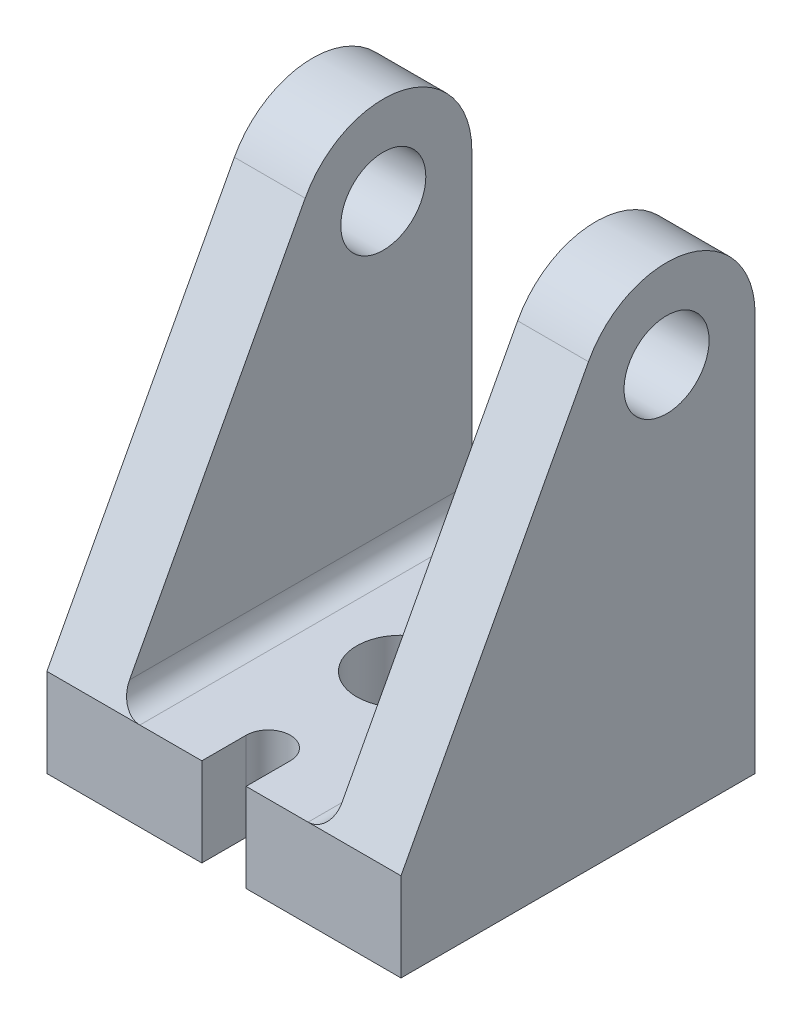
ISO-10303-21;
HEADER;
FILE_DESCRIPTION(('STEP AP214'),'2;1');
FILE_NAME('part.step','',(''),(''),'','','');
FILE_SCHEMA(('AUTOMOTIVE_DESIGN { 1 0 10303 214 1 1 1 1 }'));
ENDSEC;
DATA;
#1=APPLICATION_CONTEXT('core data for automotive mechanical design processes');
#2=APPLICATION_PROTOCOL_DEFINITION('international standard','automotive_design',2000,#1);
#3=PRODUCT_CONTEXT('',#1,'mechanical');
#4=PRODUCT('Part','Part','',(#3));
#5=PRODUCT_RELATED_PRODUCT_CATEGORY('part','',(#4));
#6=PRODUCT_DEFINITION_FORMATION('','',#4);
#7=PRODUCT_DEFINITION_CONTEXT('part definition',#1,'design');
#8=PRODUCT_DEFINITION('design','',#6,#7);
#9=PRODUCT_DEFINITION_SHAPE('','',#8);
#10=(LENGTH_UNIT() NAMED_UNIT(*) SI_UNIT(.MILLI.,.METRE.));
#11=(NAMED_UNIT(*) PLANE_ANGLE_UNIT() SI_UNIT($,.RADIAN.));
#12=(NAMED_UNIT(*) SI_UNIT($,.STERADIAN.) SOLID_ANGLE_UNIT());
#13=UNCERTAINTY_MEASURE_WITH_UNIT(LENGTH_MEASURE(1.E-05),#10,'distance_accuracy_value','');
#14=(GEOMETRIC_REPRESENTATION_CONTEXT(3) GLOBAL_UNCERTAINTY_ASSIGNED_CONTEXT((#13)) GLOBAL_UNIT_ASSIGNED_CONTEXT((#10,
#11,#12)) REPRESENTATION_CONTEXT('',''));
#15=CARTESIAN_POINT('',(0.,0.,0.));
#16=DIRECTION('',(0.,0.,1.));
#17=DIRECTION('',(1.,0.,0.));
#18=AXIS2_PLACEMENT_3D('',#15,#16,#17);
#19=CARTESIAN_POINT('',(-25.4,12.7,25.4));
#20=DIRECTION('',(0.,0.,-1.));
#21=DIRECTION('',(-1.,0.,0.));
#22=AXIS2_PLACEMENT_3D('',#19,#20,#21);
#23=PLANE('',#22);
#24=DIRECTION('',(1.,0.,0.));
#25=VECTOR('',#24,1.);
#26=CARTESIAN_POINT('',(-25.4,0.,25.4));
#27=LINE('',#26,#25);
#28=CARTESIAN_POINT('',(-25.4,0.,25.4));
#29=VERTEX_POINT('',#28);
#30=CARTESIAN_POINT('',(-3.175,0.,25.4));
#31=VERTEX_POINT('',#30);
#32=EDGE_CURVE('E168',#29,#31,#27,.T.);
#33=ORIENTED_EDGE('',*,*,#32,.T.);
#34=DIRECTION('',(0.,1.,0.));
#35=VECTOR('',#34,1.);
#36=CARTESIAN_POINT('',(-3.175,0.,25.4));
#37=LINE('',#36,#35);
#38=CARTESIAN_POINT('',(-3.175,12.7,25.4));
#39=VERTEX_POINT('',#38);
#40=EDGE_CURVE('E470',#31,#39,#37,.T.);
#41=ORIENTED_EDGE('',*,*,#40,.T.);
#42=DIRECTION('',(1.,0.,0.));
#43=VECTOR('',#42,1.);
#44=CARTESIAN_POINT('',(-25.4,12.7,25.4));
#45=LINE('',#44,#43);
#46=CARTESIAN_POINT('',(-12.065,12.7,25.4));
#47=VERTEX_POINT('',#46);
#48=EDGE_CURVE('E279',#47,#39,#45,.T.);
#49=ORIENTED_EDGE('',*,*,#48,.F.);
#50=CARTESIAN_POINT('',(-25.4,12.7,25.4));
#51=VERTEX_POINT('',#50);
#52=EDGE_CURVE('E216',#51,#47,#45,.T.);
#53=ORIENTED_EDGE('',*,*,#52,.F.);
#54=DIRECTION('',(0.,-1.,0.));
#55=VECTOR('',#54,1.);
#56=CARTESIAN_POINT('',(-25.4,12.7,25.4));
#57=LINE('',#56,#55);
#58=EDGE_CURVE('E187',#51,#29,#57,.T.);
#59=ORIENTED_EDGE('',*,*,#58,.T.);
#60=EDGE_LOOP('',(#33,#41,#49,#53,#59));
#61=FACE_BOUND('',#60,.T.);
#62=ADVANCED_FACE('F41',(#61),#23,.F.);
#63=CARTESIAN_POINT('',(-25.4,12.7,-25.4));
#64=DIRECTION('',(1.,0.,0.));
#65=DIRECTION('',(0.,0.,-1.));
#66=AXIS2_PLACEMENT_3D('',#63,#64,#65);
#67=PLANE('',#66);
#68=DIRECTION('',(0.,0.,1.));
#69=VECTOR('',#68,1.);
#70=CARTESIAN_POINT('',(-25.4,0.,-25.4));
#71=LINE('',#70,#69);
#72=CARTESIAN_POINT('',(-25.4,0.,-25.4));
#73=VERTEX_POINT('',#72);
#74=EDGE_CURVE('E170',#73,#29,#71,.T.);
#75=ORIENTED_EDGE('',*,*,#74,.T.);
#76=ORIENTED_EDGE('',*,*,#58,.F.);
#77=DIRECTION('',(0.,-0.882352941176471,0.470588235294118));
#78=VECTOR('',#77,1.);
#79=CARTESIAN_POINT('',(-25.4,12.7,25.4));
#80=LINE('',#79,#78);
#81=CARTESIAN_POINT('',(-25.4,63.1264705882353,-1.49411764705882));
#82=VERTEX_POINT('',#81);
#83=EDGE_CURVE('E238',#82,#51,#80,.T.);
#84=ORIENTED_EDGE('',*,*,#83,.F.);
#85=CARTESIAN_POINT('',(-25.4,57.15,-12.7));
#86=DIRECTION('',(1.,0.,0.));
#87=DIRECTION('',(0.,0.,1.));
#88=AXIS2_PLACEMENT_3D('',#85,#86,#87);
#89=CIRCLE('',#88,12.7);
#90=CARTESIAN_POINT('',(-25.4,57.15,-25.4));
#91=VERTEX_POINT('',#90);
#92=EDGE_CURVE('E232',#91,#82,#89,.T.);
#93=ORIENTED_EDGE('',*,*,#92,.F.);
#94=DIRECTION('',(0.,-1.,0.));
#95=VECTOR('',#94,1.);
#96=CARTESIAN_POINT('',(-25.4,12.7,-25.4));
#97=LINE('',#96,#95);
#98=EDGE_CURVE('E180',#91,#73,#97,.T.);
#99=ORIENTED_EDGE('',*,*,#98,.T.);
#100=EDGE_LOOP('',(#75,#76,#84,#93,#99));
#101=FACE_BOUND('',#100,.T.);
#102=CARTESIAN_POINT('',(-25.4,57.15,-12.7));
#103=DIRECTION('',(1.,0.,0.));
#104=DIRECTION('',(0.,0.,-1.));
#105=AXIS2_PLACEMENT_3D('',#102,#103,#104);
#106=CIRCLE('',#105,6.1);
#107=CARTESIAN_POINT('',(-25.4,57.15,-18.8));
#108=VERTEX_POINT('',#107);
#109=EDGE_CURVE('E241',#108,#108,#106,.T.);
#110=ORIENTED_EDGE('',*,*,#109,.T.);
#111=EDGE_LOOP('',(#110));
#112=FACE_BOUND('',#111,.T.);
#113=ADVANCED_FACE('F301',(#101,#112),#67,.F.);
#114=CARTESIAN_POINT('',(3.175,12.7,25.4));
#115=VERTEX_POINT('',#114);
#116=CARTESIAN_POINT('',(12.065,12.7,25.4));
#117=VERTEX_POINT('',#116);
#118=EDGE_CURVE('E158',#115,#117,#45,.T.);
#119=ORIENTED_EDGE('',*,*,#118,.F.);
#120=DIRECTION('',(0.,1.,0.));
#121=VECTOR('',#120,1.);
#122=CARTESIAN_POINT('',(3.175,0.,25.4));
#123=LINE('',#122,#121);
#124=CARTESIAN_POINT('',(3.175,0.,25.4));
#125=VERTEX_POINT('',#124);
#126=EDGE_CURVE('E150',#125,#115,#123,.T.);
#127=ORIENTED_EDGE('',*,*,#126,.F.);
#128=CARTESIAN_POINT('',(25.4,0.,25.4));
#129=VERTEX_POINT('',#128);
#130=EDGE_CURVE('E156',#125,#129,#27,.T.);
#131=ORIENTED_EDGE('',*,*,#130,.T.);
#132=DIRECTION('',(0.,-1.,0.));
#133=VECTOR('',#132,1.);
#134=CARTESIAN_POINT('',(25.4,12.7,25.4));
#135=LINE('',#134,#133);
#136=CARTESIAN_POINT('',(25.4,12.7,25.4));
#137=VERTEX_POINT('',#136);
#138=EDGE_CURVE('E183',#137,#129,#135,.T.);
#139=ORIENTED_EDGE('',*,*,#138,.F.);
#140=DIRECTION('',(1.,0.,0.));
#141=VECTOR('',#140,1.);
#142=CARTESIAN_POINT('',(15.24,12.7,25.4));
#143=LINE('',#142,#141);
#144=EDGE_CURVE('E60',#117,#137,#143,.T.);
#145=ORIENTED_EDGE('',*,*,#144,.F.);
#146=EDGE_LOOP('',(#119,#127,#131,#139,#145));
#147=FACE_BOUND('',#146,.T.);
#148=ADVANCED_FACE('F159',(#147),#23,.F.);
#149=CARTESIAN_POINT('',(25.4,12.7,-25.4));
#150=DIRECTION('',(-1.,0.,0.));
#151=DIRECTION('',(0.,0.,1.));
#152=AXIS2_PLACEMENT_3D('',#149,#150,#151);
#153=PLANE('',#152);
#154=DIRECTION('',(0.,0.,-1.));
#155=VECTOR('',#154,1.);
#156=CARTESIAN_POINT('',(25.4,0.,-25.4));
#157=LINE('',#156,#155);
#158=CARTESIAN_POINT('',(25.4,0.,-25.4));
#159=VERTEX_POINT('',#158);
#160=EDGE_CURVE('E164',#129,#159,#157,.T.);
#161=ORIENTED_EDGE('',*,*,#160,.T.);
#162=DIRECTION('',(0.,-1.,0.));
#163=VECTOR('',#162,1.);
#164=CARTESIAN_POINT('',(25.4,12.7,-25.4));
#165=LINE('',#164,#163);
#166=CARTESIAN_POINT('',(25.4,57.15,-25.4));
#167=VERTEX_POINT('',#166);
#168=EDGE_CURVE('E179',#167,#159,#165,.T.);
#169=ORIENTED_EDGE('',*,*,#168,.F.);
#170=CARTESIAN_POINT('',(25.4,57.15,-12.7));
#171=DIRECTION('',(1.,0.,0.));
#172=DIRECTION('',(0.,0.,1.));
#173=AXIS2_PLACEMENT_3D('',#170,#171,#172);
#174=CIRCLE('',#173,12.7);
#175=CARTESIAN_POINT('',(25.4,63.1264705882353,-1.49411764705882));
#176=VERTEX_POINT('',#175);
#177=EDGE_CURVE('E257',#167,#176,#174,.T.);
#178=ORIENTED_EDGE('',*,*,#177,.T.);
#179=DIRECTION('',(0.,-0.882352941176471,0.470588235294118));
#180=VECTOR('',#179,1.);
#181=CARTESIAN_POINT('',(25.4,12.7,25.4));
#182=LINE('',#181,#180);
#183=EDGE_CURVE('E264',#176,#137,#182,.T.);
#184=ORIENTED_EDGE('',*,*,#183,.T.);
#185=ORIENTED_EDGE('',*,*,#138,.T.);
#186=EDGE_LOOP('',(#161,#169,#178,#184,#185));
#187=FACE_BOUND('',#186,.T.);
#188=CARTESIAN_POINT('',(25.4,57.15,-12.7));
#189=DIRECTION('',(1.,0.,0.));
#190=DIRECTION('',(0.,0.,-1.));
#191=AXIS2_PLACEMENT_3D('',#188,#189,#190);
#192=CIRCLE('',#191,6.1);
#193=CARTESIAN_POINT('',(25.4,57.15,-18.8));
#194=VERTEX_POINT('',#193);
#195=EDGE_CURVE('E252',#194,#194,#192,.T.);
#196=ORIENTED_EDGE('',*,*,#195,.F.);
#197=EDGE_LOOP('',(#196));
#198=FACE_BOUND('',#197,.T.);
#199=ADVANCED_FACE('F330',(#187,#198),#153,.F.);
#200=CARTESIAN_POINT('',(-25.4,12.7,-25.4));
#201=DIRECTION('',(0.,0.,1.));
#202=DIRECTION('',(1.,0.,0.));
#203=AXIS2_PLACEMENT_3D('',#200,#201,#202);
#204=PLANE('',#203);
#205=DIRECTION('',(-1.,0.,0.));
#206=VECTOR('',#205,1.);
#207=CARTESIAN_POINT('',(-25.4,0.,-25.4));
#208=LINE('',#207,#206);
#209=EDGE_CURVE('E174',#159,#73,#208,.T.);
#210=ORIENTED_EDGE('',*,*,#209,.T.);
#211=ORIENTED_EDGE('',*,*,#98,.F.);
#212=DIRECTION('',(-1.,0.,0.));
#213=VECTOR('',#212,1.);
#214=CARTESIAN_POINT('',(-15.24,57.15,-25.4));
#215=LINE('',#214,#213);
#216=CARTESIAN_POINT('',(-15.24,57.15,-25.4));
#217=VERTEX_POINT('',#216);
#218=EDGE_CURVE('E247',#217,#91,#215,.T.);
#219=ORIENTED_EDGE('',*,*,#218,.F.);
#220=DIRECTION('',(0.,1.,0.));
#221=VECTOR('',#220,1.);
#222=CARTESIAN_POINT('',(-15.24,57.15,-25.4));
#223=LINE('',#222,#221);
#224=CARTESIAN_POINT('',(-15.24,15.875,-25.4));
#225=VERTEX_POINT('',#224);
#226=EDGE_CURVE('E212',#225,#217,#223,.T.);
#227=ORIENTED_EDGE('',*,*,#226,.F.);
#228=CARTESIAN_POINT('',(-12.065,15.875,-25.4));
#229=DIRECTION('',(0.,0.,1.));
#230=DIRECTION('',(1.,0.,0.));
#231=AXIS2_PLACEMENT_3D('',#228,#229,#230);
#232=CIRCLE('',#231,3.175);
#233=CARTESIAN_POINT('',(-12.065,12.7,-25.4));
#234=VERTEX_POINT('',#233);
#235=EDGE_CURVE('E49',#225,#234,#232,.T.);
#236=ORIENTED_EDGE('',*,*,#235,.T.);
#237=DIRECTION('',(-1.,0.,0.));
#238=VECTOR('',#237,1.);
#239=CARTESIAN_POINT('',(-25.4,12.7,-25.4));
#240=LINE('',#239,#238);
#241=CARTESIAN_POINT('',(12.065,12.7,-25.4));
#242=VERTEX_POINT('',#241);
#243=EDGE_CURVE('E181',#242,#234,#240,.T.);
#244=ORIENTED_EDGE('',*,*,#243,.F.);
#245=CARTESIAN_POINT('',(12.065,15.875,-25.4));
#246=DIRECTION('',(0.,0.,1.));
#247=DIRECTION('',(1.,0.,0.));
#248=AXIS2_PLACEMENT_3D('',#245,#246,#247);
#249=CIRCLE('',#248,3.175);
#250=CARTESIAN_POINT('',(15.24,15.875,-25.4));
#251=VERTEX_POINT('',#250);
#252=EDGE_CURVE('E205',#242,#251,#249,.T.);
#253=ORIENTED_EDGE('',*,*,#252,.T.);
#254=DIRECTION('',(0.,1.,0.));
#255=VECTOR('',#254,1.);
#256=CARTESIAN_POINT('',(15.24,57.15,-25.4));
#257=LINE('',#256,#255);
#258=CARTESIAN_POINT('',(15.24,57.15,-25.4));
#259=VERTEX_POINT('',#258);
#260=EDGE_CURVE('E256',#251,#259,#257,.T.);
#261=ORIENTED_EDGE('',*,*,#260,.T.);
#262=DIRECTION('',(1.,0.,0.));
#263=VECTOR('',#262,1.);
#264=CARTESIAN_POINT('',(15.24,57.15,-25.4));
#265=LINE('',#264,#263);
#266=EDGE_CURVE('E270',#259,#167,#265,.T.);
#267=ORIENTED_EDGE('',*,*,#266,.T.);
#268=ORIENTED_EDGE('',*,*,#168,.T.);
#269=EDGE_LOOP('',(#210,#211,#219,#227,#236,#244,#253,#261,#267,#268));
#270=FACE_BOUND('',#269,.T.);
#271=ADVANCED_FACE('F206',(#270),#204,.F.);
#272=CARTESIAN_POINT('',(0.,12.7,0.));
#273=DIRECTION('',(0.,1.,0.));
#274=DIRECTION('',(0.,0.,1.));
#275=AXIS2_PLACEMENT_3D('',#272,#273,#274);
#276=PLANE('',#275);
#277=CARTESIAN_POINT('',(0.,12.7,0.));
#278=DIRECTION('',(0.,1.,0.));
#279=DIRECTION('',(0.,0.,1.));
#280=AXIS2_PLACEMENT_3D('',#277,#278,#279);
#281=CIRCLE('',#280,6.35);
#282=CARTESIAN_POINT('',(0.,12.7,6.35));
#283=VERTEX_POINT('',#282);
#284=EDGE_CURVE('E467',#283,#283,#281,.T.);
#285=ORIENTED_EDGE('',*,*,#284,.F.);
#286=EDGE_LOOP('',(#285));
#287=FACE_BOUND('',#286,.T.);
#288=ORIENTED_EDGE('',*,*,#118,.T.);
#289=DIRECTION('',(0.,0.,1.));
#290=VECTOR('',#289,1.);
#291=CARTESIAN_POINT('',(12.065,12.7,-25.4));
#292=LINE('',#291,#290);
#293=EDGE_CURVE('E193',#117,#242,#292,.F.);
#294=ORIENTED_EDGE('',*,*,#293,.T.);
#295=ORIENTED_EDGE('',*,*,#243,.T.);
#296=DIRECTION('',(0.,0.,-1.));
#297=VECTOR('',#296,1.);
#298=CARTESIAN_POINT('',(-12.065,12.7,25.4));
#299=LINE('',#298,#297);
#300=EDGE_CURVE('E195',#234,#47,#299,.F.);
#301=ORIENTED_EDGE('',*,*,#300,.T.);
#302=ORIENTED_EDGE('',*,*,#48,.T.);
#303=DIRECTION('',(0.,0.,1.));
#304=VECTOR('',#303,1.);
#305=CARTESIAN_POINT('',(-3.175,12.7,25.4));
#306=LINE('',#305,#304);
#307=CARTESIAN_POINT('',(-3.175,12.7,19.05));
#308=VERTEX_POINT('',#307);
#309=EDGE_CURVE('E151',#308,#39,#306,.T.);
#310=ORIENTED_EDGE('',*,*,#309,.F.);
#311=CARTESIAN_POINT('',(0.,12.7,19.05));
#312=DIRECTION('',(0.,1.,0.));
#313=DIRECTION('',(0.,0.,-1.));
#314=AXIS2_PLACEMENT_3D('',#311,#312,#313);
#315=CIRCLE('',#314,3.175);
#316=CARTESIAN_POINT('',(3.175,12.7,19.05));
#317=VERTEX_POINT('',#316);
#318=EDGE_CURVE('E479',#317,#308,#315,.T.);
#319=ORIENTED_EDGE('',*,*,#318,.F.);
#320=DIRECTION('',(0.,0.,-1.));
#321=VECTOR('',#320,1.);
#322=CARTESIAN_POINT('',(3.175,12.7,19.05));
#323=LINE('',#322,#321);
#324=EDGE_CURVE('E278',#115,#317,#323,.T.);
#325=ORIENTED_EDGE('',*,*,#324,.F.);
#326=EDGE_LOOP('',(#288,#294,#295,#301,#302,#310,#319,#325));
#327=FACE_BOUND('',#326,.T.);
#328=ADVANCED_FACE('F217',(#287,#327),#276,.T.);
#329=CARTESIAN_POINT('',(0.,0.,0.));
#330=DIRECTION('',(0.,1.,0.));
#331=DIRECTION('',(0.,0.,1.));
#332=AXIS2_PLACEMENT_3D('',#329,#330,#331);
#333=PLANE('',#332);
#334=CARTESIAN_POINT('',(0.,0.,0.));
#335=DIRECTION('',(0.,1.,0.));
#336=DIRECTION('',(0.,0.,1.));
#337=AXIS2_PLACEMENT_3D('',#334,#335,#336);
#338=CIRCLE('',#337,6.35);
#339=CARTESIAN_POINT('',(0.,0.,6.35));
#340=VERTEX_POINT('',#339);
#341=EDGE_CURVE('E465',#340,#340,#338,.T.);
#342=ORIENTED_EDGE('',*,*,#341,.T.);
#343=EDGE_LOOP('',(#342));
#344=FACE_BOUND('',#343,.T.);
#345=CARTESIAN_POINT('',(0.,0.,19.05));
#346=DIRECTION('',(0.,1.,0.));
#347=DIRECTION('',(0.,0.,-1.));
#348=AXIS2_PLACEMENT_3D('',#345,#346,#347);
#349=CIRCLE('',#348,3.175);
#350=CARTESIAN_POINT('',(3.175,0.,19.05));
#351=VERTEX_POINT('',#350);
#352=CARTESIAN_POINT('',(-3.175,0.,19.05));
#353=VERTEX_POINT('',#352);
#354=EDGE_CURVE('E155',#351,#353,#349,.T.);
#355=ORIENTED_EDGE('',*,*,#354,.T.);
#356=DIRECTION('',(0.,0.,1.));
#357=VECTOR('',#356,1.);
#358=CARTESIAN_POINT('',(-3.175,0.,25.4));
#359=LINE('',#358,#357);
#360=EDGE_CURVE('E157',#353,#31,#359,.T.);
#361=ORIENTED_EDGE('',*,*,#360,.T.);
#362=ORIENTED_EDGE('',*,*,#32,.F.);
#363=ORIENTED_EDGE('',*,*,#74,.F.);
#364=ORIENTED_EDGE('',*,*,#209,.F.);
#365=ORIENTED_EDGE('',*,*,#160,.F.);
#366=ORIENTED_EDGE('',*,*,#130,.F.);
#367=DIRECTION('',(0.,0.,-1.));
#368=VECTOR('',#367,1.);
#369=CARTESIAN_POINT('',(3.175,0.,19.05));
#370=LINE('',#369,#368);
#371=EDGE_CURVE('E141',#125,#351,#370,.T.);
#372=ORIENTED_EDGE('',*,*,#371,.T.);
#373=EDGE_LOOP('',(#355,#361,#362,#363,#364,#365,#366,#372));
#374=FACE_BOUND('',#373,.T.);
#375=ADVANCED_FACE('F161',(#344,#374),#333,.F.);
#376=CARTESIAN_POINT('',(15.24,12.7,25.4));
#377=DIRECTION('',(0.,0.470588235294118,0.882352941176471));
#378=DIRECTION('',(0.,-0.882352941176471,0.470588235294118));
#379=AXIS2_PLACEMENT_3D('',#376,#377,#378);
#380=PLANE('',#379);
#381=ORIENTED_EDGE('',*,*,#183,.F.);
#382=DIRECTION('',(1.,0.,0.));
#383=VECTOR('',#382,1.);
#384=CARTESIAN_POINT('',(15.24,63.1264705882353,-1.49411764705882));
#385=LINE('',#384,#383);
#386=CARTESIAN_POINT('',(15.24,63.1264705882353,-1.49411764705882));
#387=VERTEX_POINT('',#386);
#388=EDGE_CURVE('E274',#387,#176,#385,.T.);
#389=ORIENTED_EDGE('',*,*,#388,.F.);
#390=DIRECTION('',(0.,-0.882352941176471,0.470588235294118));
#391=VECTOR('',#390,1.);
#392=CARTESIAN_POINT('',(15.24,12.7,25.4));
#393=LINE('',#392,#391);
#394=CARTESIAN_POINT('',(15.24,15.875,23.7066666666667));
#395=VERTEX_POINT('',#394);
#396=EDGE_CURVE('E263',#387,#395,#393,.T.);
#397=ORIENTED_EDGE('',*,*,#396,.T.);
#398=CARTESIAN_POINT('',(12.065,15.875,23.7066666666667));
#399=DIRECTION('',(0.,0.470588235294118,0.882352941176471));
#400=DIRECTION('',(0.,0.882352941176471,-0.470588235294118));
#401=AXIS2_PLACEMENT_3D('',#398,#399,#400);
#402=ELLIPSE('',#401,3.59833333333333,3.175);
#403=EDGE_CURVE('E198',#395,#117,#402,.F.);
#404=ORIENTED_EDGE('',*,*,#403,.T.);
#405=ORIENTED_EDGE('',*,*,#144,.T.);
#406=EDGE_LOOP('',(#381,#389,#397,#404,#405));
#407=FACE_BOUND('',#406,.T.);
#408=ADVANCED_FACE('F285',(#407),#380,.T.);
#409=CARTESIAN_POINT('',(15.24,57.15,-12.7));
#410=DIRECTION('',(1.,0.,0.));
#411=DIRECTION('',(0.,0.,-1.));
#412=AXIS2_PLACEMENT_3D('',#409,#410,#411);
#413=CYLINDRICAL_SURFACE('',#412,12.7);
#414=ORIENTED_EDGE('',*,*,#177,.F.);
#415=ORIENTED_EDGE('',*,*,#266,.F.);
#416=CARTESIAN_POINT('',(15.24,57.15,-12.7));
#417=DIRECTION('',(1.,0.,0.));
#418=DIRECTION('',(0.,0.,1.));
#419=AXIS2_PLACEMENT_3D('',#416,#417,#418);
#420=CIRCLE('',#419,12.7);
#421=EDGE_CURVE('E262',#259,#387,#420,.T.);
#422=ORIENTED_EDGE('',*,*,#421,.T.);
#423=ORIENTED_EDGE('',*,*,#388,.T.);
#424=EDGE_LOOP('',(#414,#415,#422,#423));
#425=FACE_BOUND('',#424,.T.);
#426=ADVANCED_FACE('F294',(#425),#413,.T.);
#427=CARTESIAN_POINT('',(15.24,57.15,-12.7));
#428=DIRECTION('',(-1.,0.,0.));
#429=DIRECTION('',(0.,0.,1.));
#430=AXIS2_PLACEMENT_3D('',#427,#428,#429);
#431=PLANE('',#430);
#432=CARTESIAN_POINT('',(15.24,57.15,-12.7));
#433=DIRECTION('',(1.,0.,0.));
#434=DIRECTION('',(0.,0.,-1.));
#435=AXIS2_PLACEMENT_3D('',#432,#433,#434);
#436=CIRCLE('',#435,6.1);
#437=CARTESIAN_POINT('',(15.24,57.15,-18.8));
#438=VERTEX_POINT('',#437);
#439=EDGE_CURVE('E254',#438,#438,#436,.T.);
#440=ORIENTED_EDGE('',*,*,#439,.T.);
#441=EDGE_LOOP('',(#440));
#442=FACE_BOUND('',#441,.T.);
#443=ORIENTED_EDGE('',*,*,#260,.F.);
#444=DIRECTION('',(0.,0.,1.));
#445=VECTOR('',#444,1.);
#446=CARTESIAN_POINT('',(15.24,15.875,25.4));
#447=LINE('',#446,#445);
#448=EDGE_CURVE('E186',#251,#395,#447,.T.);
#449=ORIENTED_EDGE('',*,*,#448,.T.);
#450=ORIENTED_EDGE('',*,*,#396,.F.);
#451=ORIENTED_EDGE('',*,*,#421,.F.);
#452=EDGE_LOOP('',(#443,#449,#450,#451));
#453=FACE_BOUND('',#452,.T.);
#454=ADVANCED_FACE('F292',(#442,#453),#431,.T.);
#455=CARTESIAN_POINT('',(15.24,57.15,-12.7));
#456=DIRECTION('',(1.,0.,0.));
#457=DIRECTION('',(0.,0.,-1.));
#458=AXIS2_PLACEMENT_3D('',#455,#456,#457);
#459=CYLINDRICAL_SURFACE('',#458,6.1);
#460=ORIENTED_EDGE('',*,*,#439,.F.);
#461=EDGE_LOOP('',(#460));
#462=FACE_BOUND('',#461,.T.);
#463=ORIENTED_EDGE('',*,*,#195,.T.);
#464=EDGE_LOOP('',(#463));
#465=FACE_BOUND('',#464,.T.);
#466=ADVANCED_FACE('F320',(#462,#465),#459,.F.);
#467=CARTESIAN_POINT('',(-15.24,57.15,-12.7));
#468=DIRECTION('',(1.,0.,0.));
#469=DIRECTION('',(0.,0.,1.));
#470=AXIS2_PLACEMENT_3D('',#467,#468,#469);
#471=PLANE('',#470);
#472=DIRECTION('',(0.,-0.882352941176471,0.470588235294118));
#473=VECTOR('',#472,1.);
#474=CARTESIAN_POINT('',(-15.24,12.7,25.4));
#475=LINE('',#474,#473);
#476=CARTESIAN_POINT('',(-15.24,63.1264705882353,-1.49411764705882));
#477=VERTEX_POINT('',#476);
#478=CARTESIAN_POINT('',(-15.24,15.875,23.7066666666667));
#479=VERTEX_POINT('',#478);
#480=EDGE_CURVE('E226',#477,#479,#475,.T.);
#481=ORIENTED_EDGE('',*,*,#480,.T.);
#482=DIRECTION('',(0.,0.,-1.));
#483=VECTOR('',#482,1.);
#484=CARTESIAN_POINT('',(-15.24,15.875,-25.4));
#485=LINE('',#484,#483);
#486=EDGE_CURVE('E199',#479,#225,#485,.T.);
#487=ORIENTED_EDGE('',*,*,#486,.T.);
#488=ORIENTED_EDGE('',*,*,#226,.T.);
#489=CARTESIAN_POINT('',(-15.24,57.15,-12.7));
#490=DIRECTION('',(1.,0.,0.));
#491=DIRECTION('',(0.,0.,1.));
#492=AXIS2_PLACEMENT_3D('',#489,#490,#491);
#493=CIRCLE('',#492,12.7);
#494=EDGE_CURVE('E231',#217,#477,#493,.T.);
#495=ORIENTED_EDGE('',*,*,#494,.T.);
#496=EDGE_LOOP('',(#481,#487,#488,#495));
#497=FACE_BOUND('',#496,.T.);
#498=CARTESIAN_POINT('',(-15.24,57.15,-12.7));
#499=DIRECTION('',(1.,0.,0.));
#500=DIRECTION('',(0.,0.,-1.));
#501=AXIS2_PLACEMENT_3D('',#498,#499,#500);
#502=CIRCLE('',#501,6.1);
#503=CARTESIAN_POINT('',(-15.24,57.15,-18.8));
#504=VERTEX_POINT('',#503);
#505=EDGE_CURVE('E246',#504,#504,#502,.T.);
#506=ORIENTED_EDGE('',*,*,#505,.F.);
#507=EDGE_LOOP('',(#506));
#508=FACE_BOUND('',#507,.T.);
#509=ADVANCED_FACE('F229',(#497,#508),#471,.T.);
#510=CARTESIAN_POINT('',(-15.24,57.15,-12.7));
#511=DIRECTION('',(-1.,0.,0.));
#512=DIRECTION('',(0.,0.,1.));
#513=AXIS2_PLACEMENT_3D('',#510,#511,#512);
#514=CYLINDRICAL_SURFACE('',#513,12.7);
#515=ORIENTED_EDGE('',*,*,#92,.T.);
#516=DIRECTION('',(-1.,0.,0.));
#517=VECTOR('',#516,1.);
#518=CARTESIAN_POINT('',(-15.24,63.1264705882353,-1.49411764705882));
#519=LINE('',#518,#517);
#520=EDGE_CURVE('E244',#477,#82,#519,.T.);
#521=ORIENTED_EDGE('',*,*,#520,.F.);
#522=ORIENTED_EDGE('',*,*,#494,.F.);
#523=ORIENTED_EDGE('',*,*,#218,.T.);
#524=EDGE_LOOP('',(#515,#521,#522,#523));
#525=FACE_BOUND('',#524,.T.);
#526=ADVANCED_FACE('F306',(#525),#514,.T.);
#527=CARTESIAN_POINT('',(-15.24,12.7,25.4));
#528=DIRECTION('',(0.,-0.470588235294118,-0.882352941176471));
#529=DIRECTION('',(0.,0.882352941176471,-0.470588235294118));
#530=AXIS2_PLACEMENT_3D('',#527,#528,#529);
#531=PLANE('',#530);
#532=ORIENTED_EDGE('',*,*,#83,.T.);
#533=ORIENTED_EDGE('',*,*,#52,.T.);
#534=CARTESIAN_POINT('',(-12.065,15.875,23.7066666666667));
#535=DIRECTION('',(0.,-0.470588235294118,-0.882352941176471));
#536=DIRECTION('',(0.,-0.882352941176471,0.470588235294118));
#537=AXIS2_PLACEMENT_3D('',#534,#535,#536);
#538=ELLIPSE('',#537,3.59833333333333,3.175);
#539=EDGE_CURVE('E11',#47,#479,#538,.T.);
#540=ORIENTED_EDGE('',*,*,#539,.T.);
#541=ORIENTED_EDGE('',*,*,#480,.F.);
#542=ORIENTED_EDGE('',*,*,#520,.T.);
#543=EDGE_LOOP('',(#532,#533,#540,#541,#542));
#544=FACE_BOUND('',#543,.T.);
#545=ADVANCED_FACE('F228',(#544),#531,.F.);
#546=CARTESIAN_POINT('',(-15.24,57.15,-12.7));
#547=DIRECTION('',(-1.,0.,0.));
#548=DIRECTION('',(0.,0.,1.));
#549=AXIS2_PLACEMENT_3D('',#546,#547,#548);
#550=CYLINDRICAL_SURFACE('',#549,6.1);
#551=ORIENTED_EDGE('',*,*,#505,.T.);
#552=EDGE_LOOP('',(#551));
#553=FACE_BOUND('',#552,.T.);
#554=ORIENTED_EDGE('',*,*,#109,.F.);
#555=EDGE_LOOP('',(#554));
#556=FACE_BOUND('',#555,.T.);
#557=ADVANCED_FACE('F313',(#553,#556),#550,.F.);
#558=CARTESIAN_POINT('',(-3.175,0.,25.4));
#559=DIRECTION('',(-1.,0.,0.));
#560=DIRECTION('',(0.,0.,1.));
#561=AXIS2_PLACEMENT_3D('',#558,#559,#560);
#562=PLANE('',#561);
#563=ORIENTED_EDGE('',*,*,#309,.T.);
#564=ORIENTED_EDGE('',*,*,#40,.F.);
#565=ORIENTED_EDGE('',*,*,#360,.F.);
#566=DIRECTION('',(0.,1.,0.));
#567=VECTOR('',#566,1.);
#568=CARTESIAN_POINT('',(-3.175,0.,19.05));
#569=LINE('',#568,#567);
#570=EDGE_CURVE('E472',#353,#308,#569,.T.);
#571=ORIENTED_EDGE('',*,*,#570,.T.);
#572=EDGE_LOOP('',(#563,#564,#565,#571));
#573=FACE_BOUND('',#572,.T.);
#574=ADVANCED_FACE('F401',(#573),#562,.F.);
#575=CARTESIAN_POINT('',(0.,0.,19.05));
#576=DIRECTION('',(0.,1.,0.));
#577=DIRECTION('',(0.,0.,1.));
#578=AXIS2_PLACEMENT_3D('',#575,#576,#577);
#579=CYLINDRICAL_SURFACE('',#578,3.175);
#580=ORIENTED_EDGE('',*,*,#318,.T.);
#581=ORIENTED_EDGE('',*,*,#570,.F.);
#582=ORIENTED_EDGE('',*,*,#354,.F.);
#583=DIRECTION('',(0.,1.,0.));
#584=VECTOR('',#583,1.);
#585=CARTESIAN_POINT('',(3.175,0.,19.05));
#586=LINE('',#585,#584);
#587=EDGE_CURVE('E146',#351,#317,#586,.T.);
#588=ORIENTED_EDGE('',*,*,#587,.T.);
#589=EDGE_LOOP('',(#580,#581,#582,#588));
#590=FACE_BOUND('',#589,.T.);
#591=ADVANCED_FACE('F416',(#590),#579,.F.);
#592=CARTESIAN_POINT('',(3.175,0.,19.05));
#593=DIRECTION('',(1.,0.,0.));
#594=DIRECTION('',(0.,0.,-1.));
#595=AXIS2_PLACEMENT_3D('',#592,#593,#594);
#596=PLANE('',#595);
#597=ORIENTED_EDGE('',*,*,#324,.T.);
#598=ORIENTED_EDGE('',*,*,#587,.F.);
#599=ORIENTED_EDGE('',*,*,#371,.F.);
#600=ORIENTED_EDGE('',*,*,#126,.T.);
#601=EDGE_LOOP('',(#597,#598,#599,#600));
#602=FACE_BOUND('',#601,.T.);
#603=ADVANCED_FACE('F147',(#602),#596,.F.);
#604=CARTESIAN_POINT('',(0.,0.,0.));
#605=DIRECTION('',(0.,1.,0.));
#606=DIRECTION('',(0.,0.,1.));
#607=AXIS2_PLACEMENT_3D('',#604,#605,#606);
#608=CYLINDRICAL_SURFACE('',#607,6.35);
#609=ORIENTED_EDGE('',*,*,#341,.F.);
#610=EDGE_LOOP('',(#609));
#611=FACE_BOUND('',#610,.T.);
#612=ORIENTED_EDGE('',*,*,#284,.T.);
#613=EDGE_LOOP('',(#612));
#614=FACE_BOUND('',#613,.T.);
#615=ADVANCED_FACE('F436',(#611,#614),#608,.F.);
#616=CARTESIAN_POINT('',(12.065,15.875,-12.7));
#617=DIRECTION('',(0.,0.,-1.));
#618=DIRECTION('',(-1.,0.,0.));
#619=AXIS2_PLACEMENT_3D('',#616,#617,#618);
#620=CYLINDRICAL_SURFACE('',#619,3.175);
#621=ORIENTED_EDGE('',*,*,#252,.F.);
#622=ORIENTED_EDGE('',*,*,#293,.F.);
#623=ORIENTED_EDGE('',*,*,#403,.F.);
#624=ORIENTED_EDGE('',*,*,#448,.F.);
#625=EDGE_LOOP('',(#621,#622,#623,#624));
#626=FACE_BOUND('',#625,.T.);
#627=ADVANCED_FACE('F286',(#626),#620,.F.);
#628=CARTESIAN_POINT('',(-12.065,15.875,-12.7));
#629=DIRECTION('',(0.,0.,1.));
#630=DIRECTION('',(1.,0.,0.));
#631=AXIS2_PLACEMENT_3D('',#628,#629,#630);
#632=CYLINDRICAL_SURFACE('',#631,3.175);
#633=ORIENTED_EDGE('',*,*,#539,.F.);
#634=ORIENTED_EDGE('',*,*,#300,.F.);
#635=ORIENTED_EDGE('',*,*,#235,.F.);
#636=ORIENTED_EDGE('',*,*,#486,.F.);
#637=EDGE_LOOP('',(#633,#634,#635,#636));
#638=FACE_BOUND('',#637,.T.);
#639=ADVANCED_FACE('F43',(#638),#632,.F.);
#640=CLOSED_SHELL('',(#62,#113,#148,#199,#271,#328,#375,#408,#426,#454,#466,#509,#526,#545,#557,
#574,#591,#603,#615,#627,#639));
#641=MANIFOLD_SOLID_BREP('B2',#640);
#642=ADVANCED_BREP_SHAPE_REPRESENTATION('',(#18,#641),#14);
#643=SHAPE_DEFINITION_REPRESENTATION(#9,#642);
ENDSEC;
END-ISO-10303-21;
